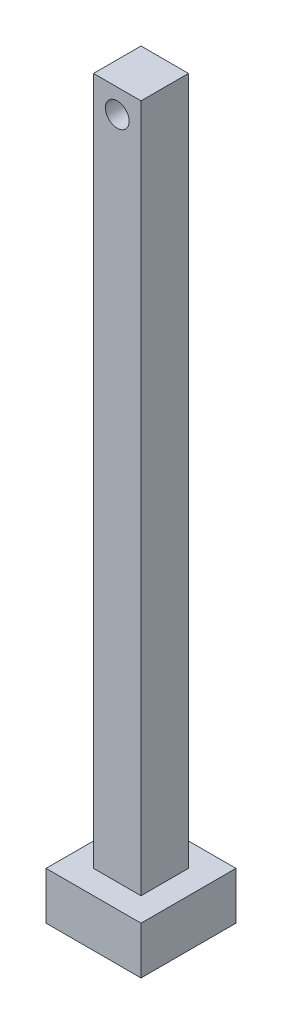
ISO-10303-21;
HEADER;
FILE_DESCRIPTION(('STEP AP214'),'2;1');
FILE_NAME('part.step','',(''),(''),'','','');
FILE_SCHEMA(('AUTOMOTIVE_DESIGN { 1 0 10303 214 1 1 1 1 }'));
ENDSEC;
DATA;
#1=APPLICATION_CONTEXT('core data for automotive mechanical design processes');
#2=APPLICATION_PROTOCOL_DEFINITION('international standard','automotive_design',2000,#1);
#3=PRODUCT_CONTEXT('',#1,'mechanical');
#4=PRODUCT('Part','Part','',(#3));
#5=PRODUCT_RELATED_PRODUCT_CATEGORY('part','',(#4));
#6=PRODUCT_DEFINITION_FORMATION('','',#4);
#7=PRODUCT_DEFINITION_CONTEXT('part definition',#1,'design');
#8=PRODUCT_DEFINITION('design','',#6,#7);
#9=PRODUCT_DEFINITION_SHAPE('','',#8);
#10=(LENGTH_UNIT() NAMED_UNIT(*) SI_UNIT(.MILLI.,.METRE.));
#11=(NAMED_UNIT(*) PLANE_ANGLE_UNIT() SI_UNIT($,.RADIAN.));
#12=(NAMED_UNIT(*) SI_UNIT($,.STERADIAN.) SOLID_ANGLE_UNIT());
#13=UNCERTAINTY_MEASURE_WITH_UNIT(LENGTH_MEASURE(1.E-05),#10,'distance_accuracy_value','');
#14=(GEOMETRIC_REPRESENTATION_CONTEXT(3) GLOBAL_UNCERTAINTY_ASSIGNED_CONTEXT((#13)) GLOBAL_UNIT_ASSIGNED_CONTEXT((#10,
#11,#12)) REPRESENTATION_CONTEXT('',''));
#15=CARTESIAN_POINT('',(0.,0.,0.));
#16=DIRECTION('',(0.,0.,1.));
#17=DIRECTION('',(1.,0.,0.));
#18=AXIS2_PLACEMENT_3D('',#15,#16,#17);
#19=CARTESIAN_POINT('',(0.,0.,10.));
#20=DIRECTION('',(0.,0.,-1.));
#21=DIRECTION('',(-1.,0.,0.));
#22=AXIS2_PLACEMENT_3D('',#19,#20,#21);
#23=PLANE('',#22);
#24=DIRECTION('',(0.,-1.,0.));
#25=VECTOR('',#24,1.);
#26=CARTESIAN_POINT('',(0.,0.,10.));
#27=LINE('',#26,#25);
#28=CARTESIAN_POINT('',(0.,300.,10.));
#29=VERTEX_POINT('',#28);
#30=CARTESIAN_POINT('',(0.,10.,10.));
#31=VERTEX_POINT('',#30);
#32=EDGE_CURVE('E78',#29,#31,#27,.T.);
#33=ORIENTED_EDGE('',*,*,#32,.T.);
#34=DIRECTION('',(1.,0.,0.));
#35=VECTOR('',#34,1.);
#36=CARTESIAN_POINT('',(0.,10.,10.));
#37=LINE('',#36,#35);
#38=CARTESIAN_POINT('',(20.,10.,10.));
#39=VERTEX_POINT('',#38);
#40=EDGE_CURVE('E104',#31,#39,#37,.T.);
#41=ORIENTED_EDGE('',*,*,#40,.T.);
#42=DIRECTION('',(0.,1.,0.));
#43=VECTOR('',#42,1.);
#44=CARTESIAN_POINT('',(20.,0.,10.));
#45=LINE('',#44,#43);
#46=CARTESIAN_POINT('',(19.9999999999999,300.,10.));
#47=VERTEX_POINT('',#46);
#48=EDGE_CURVE('E97',#39,#47,#45,.T.);
#49=ORIENTED_EDGE('',*,*,#48,.T.);
#50=DIRECTION('',(-1.,0.,0.));
#51=VECTOR('',#50,1.);
#52=CARTESIAN_POINT('',(0.,300.,10.));
#53=LINE('',#52,#51);
#54=EDGE_CURVE('E56',#47,#29,#53,.T.);
#55=ORIENTED_EDGE('',*,*,#54,.T.);
#56=EDGE_LOOP('',(#33,#41,#49,#55));
#57=FACE_BOUND('',#56,.T.);
#58=CARTESIAN_POINT('',(10.,290.,10.));
#59=DIRECTION('',(0.,0.,1.));
#60=DIRECTION('',(1.,0.,0.));
#61=AXIS2_PLACEMENT_3D('',#58,#59,#60);
#62=CIRCLE('',#61,5.);
#63=CARTESIAN_POINT('',(15.,290.,10.));
#64=VERTEX_POINT('',#63);
#65=EDGE_CURVE('E89',#64,#64,#62,.T.);
#66=ORIENTED_EDGE('',*,*,#65,.F.);
#67=EDGE_LOOP('',(#66));
#68=FACE_BOUND('',#67,.T.);
#69=ADVANCED_FACE('F33',(#57,#68),#23,.F.);
#70=CARTESIAN_POINT('',(0.,0.,-10.));
#71=DIRECTION('',(0.,0.,-1.));
#72=DIRECTION('',(-1.,0.,0.));
#73=AXIS2_PLACEMENT_3D('',#70,#71,#72);
#74=PLANE('',#73);
#75=DIRECTION('',(1.,0.,0.));
#76=VECTOR('',#75,1.);
#77=CARTESIAN_POINT('',(0.,10.,-10.));
#78=LINE('',#77,#76);
#79=CARTESIAN_POINT('',(0.,10.,-10.));
#80=VERTEX_POINT('',#79);
#81=CARTESIAN_POINT('',(20.,10.,-10.));
#82=VERTEX_POINT('',#81);
#83=EDGE_CURVE('E48',#80,#82,#78,.T.);
#84=ORIENTED_EDGE('',*,*,#83,.F.);
#85=DIRECTION('',(0.,-1.,0.));
#86=VECTOR('',#85,1.);
#87=CARTESIAN_POINT('',(0.,0.,-10.));
#88=LINE('',#87,#86);
#89=CARTESIAN_POINT('',(0.,300.,-10.));
#90=VERTEX_POINT('',#89);
#91=EDGE_CURVE('E85',#90,#80,#88,.T.);
#92=ORIENTED_EDGE('',*,*,#91,.F.);
#93=DIRECTION('',(-1.,0.,0.));
#94=VECTOR('',#93,1.);
#95=CARTESIAN_POINT('',(0.,300.,-10.));
#96=LINE('',#95,#94);
#97=CARTESIAN_POINT('',(19.9999999999999,300.,-10.));
#98=VERTEX_POINT('',#97);
#99=EDGE_CURVE('E69',#98,#90,#96,.T.);
#100=ORIENTED_EDGE('',*,*,#99,.F.);
#101=DIRECTION('',(0.,1.,0.));
#102=VECTOR('',#101,1.);
#103=CARTESIAN_POINT('',(20.,0.,-10.));
#104=LINE('',#103,#102);
#105=EDGE_CURVE('E79',#82,#98,#104,.T.);
#106=ORIENTED_EDGE('',*,*,#105,.F.);
#107=EDGE_LOOP('',(#84,#92,#100,#106));
#108=FACE_BOUND('',#107,.T.);
#109=CARTESIAN_POINT('',(10.,290.,-10.));
#110=DIRECTION('',(0.,0.,1.));
#111=DIRECTION('',(1.,0.,0.));
#112=AXIS2_PLACEMENT_3D('',#109,#110,#111);
#113=CIRCLE('',#112,5.);
#114=CARTESIAN_POINT('',(15.,290.,-10.));
#115=VERTEX_POINT('',#114);
#116=EDGE_CURVE('E93',#115,#115,#113,.T.);
#117=ORIENTED_EDGE('',*,*,#116,.T.);
#118=EDGE_LOOP('',(#117));
#119=FACE_BOUND('',#118,.T.);
#120=ADVANCED_FACE('F87',(#108,#119),#74,.T.);
#121=CARTESIAN_POINT('',(0.,0.,10.));
#122=DIRECTION('',(1.,0.,0.));
#123=DIRECTION('',(0.,0.,-1.));
#124=AXIS2_PLACEMENT_3D('',#121,#122,#123);
#125=PLANE('',#124);
#126=ORIENTED_EDGE('',*,*,#91,.T.);
#127=DIRECTION('',(0.,0.,1.));
#128=VECTOR('',#127,1.);
#129=CARTESIAN_POINT('',(0.,10.,10.));
#130=LINE('',#129,#128);
#131=EDGE_CURVE('E101',#80,#31,#130,.T.);
#132=ORIENTED_EDGE('',*,*,#131,.T.);
#133=ORIENTED_EDGE('',*,*,#32,.F.);
#134=DIRECTION('',(0.,0.,-1.));
#135=VECTOR('',#134,1.);
#136=CARTESIAN_POINT('',(0.,300.,10.));
#137=LINE('',#136,#135);
#138=EDGE_CURVE('E72',#29,#90,#137,.T.);
#139=ORIENTED_EDGE('',*,*,#138,.T.);
#140=EDGE_LOOP('',(#126,#132,#133,#139));
#141=FACE_BOUND('',#140,.T.);
#142=ADVANCED_FACE('F35',(#141),#125,.F.);
#143=CARTESIAN_POINT('',(20.,0.,10.));
#144=DIRECTION('',(-1.,0.,0.));
#145=DIRECTION('',(0.,-1.,0.));
#146=AXIS2_PLACEMENT_3D('',#143,#144,#145);
#147=PLANE('',#146);
#148=ORIENTED_EDGE('',*,*,#48,.F.);
#149=DIRECTION('',(0.,0.,-1.));
#150=VECTOR('',#149,1.);
#151=CARTESIAN_POINT('',(20.,10.,10.));
#152=LINE('',#151,#150);
#153=EDGE_CURVE('E11',#39,#82,#152,.T.);
#154=ORIENTED_EDGE('',*,*,#153,.T.);
#155=ORIENTED_EDGE('',*,*,#105,.T.);
#156=DIRECTION('',(0.,0.,-1.));
#157=VECTOR('',#156,1.);
#158=CARTESIAN_POINT('',(19.9999999999999,300.,10.));
#159=LINE('',#158,#157);
#160=EDGE_CURVE('E41',#47,#98,#159,.T.);
#161=ORIENTED_EDGE('',*,*,#160,.F.);
#162=EDGE_LOOP('',(#148,#154,#155,#161));
#163=FACE_BOUND('',#162,.T.);
#164=ADVANCED_FACE('F193',(#163),#147,.F.);
#165=CARTESIAN_POINT('',(0.,300.,10.));
#166=DIRECTION('',(0.,-1.,0.));
#167=DIRECTION('',(0.,0.,-1.));
#168=AXIS2_PLACEMENT_3D('',#165,#166,#167);
#169=PLANE('',#168);
#170=ORIENTED_EDGE('',*,*,#99,.T.);
#171=ORIENTED_EDGE('',*,*,#138,.F.);
#172=ORIENTED_EDGE('',*,*,#54,.F.);
#173=ORIENTED_EDGE('',*,*,#160,.T.);
#174=EDGE_LOOP('',(#170,#171,#172,#173));
#175=FACE_BOUND('',#174,.T.);
#176=ADVANCED_FACE('F71',(#175),#169,.F.);
#177=CARTESIAN_POINT('',(10.,290.,10.));
#178=DIRECTION('',(0.,0.,-1.));
#179=DIRECTION('',(-1.,0.,0.));
#180=AXIS2_PLACEMENT_3D('',#177,#178,#179);
#181=CYLINDRICAL_SURFACE('',#180,5.);
#182=ORIENTED_EDGE('',*,*,#65,.T.);
#183=EDGE_LOOP('',(#182));
#184=FACE_BOUND('',#183,.T.);
#185=ORIENTED_EDGE('',*,*,#116,.F.);
#186=EDGE_LOOP('',(#185));
#187=FACE_BOUND('',#186,.T.);
#188=ADVANCED_FACE('F183',(#184,#187),#181,.F.);
#189=CARTESIAN_POINT('',(0.,10.,0.));
#190=DIRECTION('',(0.,1.,0.));
#191=DIRECTION('',(0.,0.,1.));
#192=AXIS2_PLACEMENT_3D('',#189,#190,#191);
#193=PLANE('',#192);
#194=DIRECTION('',(0.,0.,1.));
#195=VECTOR('',#194,1.);
#196=CARTESIAN_POINT('',(-10.,10.,-20.));
#197=LINE('',#196,#195);
#198=CARTESIAN_POINT('',(-10.,10.,-20.));
#199=VERTEX_POINT('',#198);
#200=CARTESIAN_POINT('',(-9.99999999999999,10.,20.));
#201=VERTEX_POINT('',#200);
#202=EDGE_CURVE('E124',#199,#201,#197,.T.);
#203=ORIENTED_EDGE('',*,*,#202,.T.);
#204=DIRECTION('',(1.,0.,0.));
#205=VECTOR('',#204,1.);
#206=CARTESIAN_POINT('',(-9.99999999999999,10.,20.));
#207=LINE('',#206,#205);
#208=CARTESIAN_POINT('',(30.,10.,20.));
#209=VERTEX_POINT('',#208);
#210=EDGE_CURVE('E139',#201,#209,#207,.T.);
#211=ORIENTED_EDGE('',*,*,#210,.T.);
#212=DIRECTION('',(0.,0.,-1.));
#213=VECTOR('',#212,1.);
#214=CARTESIAN_POINT('',(30.,10.,-20.));
#215=LINE('',#214,#213);
#216=CARTESIAN_POINT('',(30.,10.,-20.));
#217=VERTEX_POINT('',#216);
#218=EDGE_CURVE('E136',#209,#217,#215,.T.);
#219=ORIENTED_EDGE('',*,*,#218,.T.);
#220=DIRECTION('',(-1.,0.,0.));
#221=VECTOR('',#220,1.);
#222=CARTESIAN_POINT('',(-10.,10.,-20.));
#223=LINE('',#222,#221);
#224=EDGE_CURVE('E120',#217,#199,#223,.T.);
#225=ORIENTED_EDGE('',*,*,#224,.T.);
#226=EDGE_LOOP('',(#203,#211,#219,#225));
#227=FACE_BOUND('',#226,.T.);
#228=ORIENTED_EDGE('',*,*,#131,.F.);
#229=ORIENTED_EDGE('',*,*,#83,.T.);
#230=ORIENTED_EDGE('',*,*,#153,.F.);
#231=ORIENTED_EDGE('',*,*,#40,.F.);
#232=EDGE_LOOP('',(#228,#229,#230,#231));
#233=FACE_BOUND('',#232,.T.);
#234=ADVANCED_FACE('F147',(#227,#233),#193,.T.);
#235=CARTESIAN_POINT('',(-10.,10.,-20.));
#236=DIRECTION('',(1.,0.,0.));
#237=DIRECTION('',(0.,0.,-1.));
#238=AXIS2_PLACEMENT_3D('',#235,#236,#237);
#239=PLANE('',#238);
#240=DIRECTION('',(0.,0.,1.));
#241=VECTOR('',#240,1.);
#242=CARTESIAN_POINT('',(-10.,-10.,-20.));
#243=LINE('',#242,#241);
#244=CARTESIAN_POINT('',(-10.,-10.,-20.));
#245=VERTEX_POINT('',#244);
#246=CARTESIAN_POINT('',(-9.99999999999999,-10.,20.));
#247=VERTEX_POINT('',#246);
#248=EDGE_CURVE('E131',#245,#247,#243,.T.);
#249=ORIENTED_EDGE('',*,*,#248,.T.);
#250=DIRECTION('',(0.,-1.,0.));
#251=VECTOR('',#250,1.);
#252=CARTESIAN_POINT('',(-9.99999999999999,10.,20.));
#253=LINE('',#252,#251);
#254=EDGE_CURVE('E108',#201,#247,#253,.T.);
#255=ORIENTED_EDGE('',*,*,#254,.F.);
#256=ORIENTED_EDGE('',*,*,#202,.F.);
#257=DIRECTION('',(0.,-1.,0.));
#258=VECTOR('',#257,1.);
#259=CARTESIAN_POINT('',(-10.,10.,-20.));
#260=LINE('',#259,#258);
#261=EDGE_CURVE('E117',#199,#245,#260,.T.);
#262=ORIENTED_EDGE('',*,*,#261,.T.);
#263=EDGE_LOOP('',(#249,#255,#256,#262));
#264=FACE_BOUND('',#263,.T.);
#265=ADVANCED_FACE('F157',(#264),#239,.F.);
#266=CARTESIAN_POINT('',(-9.99999999999999,10.,20.));
#267=DIRECTION('',(0.,0.,-1.));
#268=DIRECTION('',(-1.,0.,0.));
#269=AXIS2_PLACEMENT_3D('',#266,#267,#268);
#270=PLANE('',#269);
#271=DIRECTION('',(1.,0.,0.));
#272=VECTOR('',#271,1.);
#273=CARTESIAN_POINT('',(-9.99999999999999,-10.,20.));
#274=LINE('',#273,#272);
#275=CARTESIAN_POINT('',(30.,-10.,20.));
#276=VERTEX_POINT('',#275);
#277=EDGE_CURVE('E128',#247,#276,#274,.T.);
#278=ORIENTED_EDGE('',*,*,#277,.T.);
#279=DIRECTION('',(0.,-1.,0.));
#280=VECTOR('',#279,1.);
#281=CARTESIAN_POINT('',(30.,10.,20.));
#282=LINE('',#281,#280);
#283=EDGE_CURVE('E111',#209,#276,#282,.T.);
#284=ORIENTED_EDGE('',*,*,#283,.F.);
#285=ORIENTED_EDGE('',*,*,#210,.F.);
#286=ORIENTED_EDGE('',*,*,#254,.T.);
#287=EDGE_LOOP('',(#278,#284,#285,#286));
#288=FACE_BOUND('',#287,.T.);
#289=ADVANCED_FACE('F161',(#288),#270,.F.);
#290=CARTESIAN_POINT('',(30.,10.,-20.));
#291=DIRECTION('',(-1.,0.,0.));
#292=DIRECTION('',(0.,0.,1.));
#293=AXIS2_PLACEMENT_3D('',#290,#291,#292);
#294=PLANE('',#293);
#295=DIRECTION('',(0.,0.,-1.));
#296=VECTOR('',#295,1.);
#297=CARTESIAN_POINT('',(30.,-10.,-20.));
#298=LINE('',#297,#296);
#299=CARTESIAN_POINT('',(30.,-10.,-20.));
#300=VERTEX_POINT('',#299);
#301=EDGE_CURVE('E125',#276,#300,#298,.T.);
#302=ORIENTED_EDGE('',*,*,#301,.T.);
#303=DIRECTION('',(0.,-1.,0.));
#304=VECTOR('',#303,1.);
#305=CARTESIAN_POINT('',(30.,10.,-20.));
#306=LINE('',#305,#304);
#307=EDGE_CURVE('E114',#217,#300,#306,.T.);
#308=ORIENTED_EDGE('',*,*,#307,.F.);
#309=ORIENTED_EDGE('',*,*,#218,.F.);
#310=ORIENTED_EDGE('',*,*,#283,.T.);
#311=EDGE_LOOP('',(#302,#308,#309,#310));
#312=FACE_BOUND('',#311,.T.);
#313=ADVANCED_FACE('F229',(#312),#294,.F.);
#314=CARTESIAN_POINT('',(-10.,10.,-20.));
#315=DIRECTION('',(0.,0.,1.));
#316=DIRECTION('',(1.,0.,0.));
#317=AXIS2_PLACEMENT_3D('',#314,#315,#316);
#318=PLANE('',#317);
#319=DIRECTION('',(-1.,0.,0.));
#320=VECTOR('',#319,1.);
#321=CARTESIAN_POINT('',(-10.,-10.,-20.));
#322=LINE('',#321,#320);
#323=EDGE_CURVE('E121',#300,#245,#322,.T.);
#324=ORIENTED_EDGE('',*,*,#323,.T.);
#325=ORIENTED_EDGE('',*,*,#261,.F.);
#326=ORIENTED_EDGE('',*,*,#224,.F.);
#327=ORIENTED_EDGE('',*,*,#307,.T.);
#328=EDGE_LOOP('',(#324,#325,#326,#327));
#329=FACE_BOUND('',#328,.T.);
#330=ADVANCED_FACE('F236',(#329),#318,.F.);
#331=CARTESIAN_POINT('',(0.,-10.,0.));
#332=DIRECTION('',(0.,1.,0.));
#333=DIRECTION('',(0.,0.,1.));
#334=AXIS2_PLACEMENT_3D('',#331,#332,#333);
#335=PLANE('',#334);
#336=ORIENTED_EDGE('',*,*,#248,.F.);
#337=ORIENTED_EDGE('',*,*,#323,.F.);
#338=ORIENTED_EDGE('',*,*,#301,.F.);
#339=ORIENTED_EDGE('',*,*,#277,.F.);
#340=EDGE_LOOP('',(#336,#337,#338,#339));
#341=FACE_BOUND('',#340,.T.);
#342=ADVANCED_FACE('F244',(#341),#335,.F.);
#343=CLOSED_SHELL('',(#69,#120,#142,#164,#176,#188,#234,#265,#289,#313,#330,#342));
#344=MANIFOLD_SOLID_BREP('B2',#343);
#345=ADVANCED_BREP_SHAPE_REPRESENTATION('',(#18,#344),#14);
#346=SHAPE_DEFINITION_REPRESENTATION(#9,#345);
ENDSEC;
END-ISO-10303-21;
